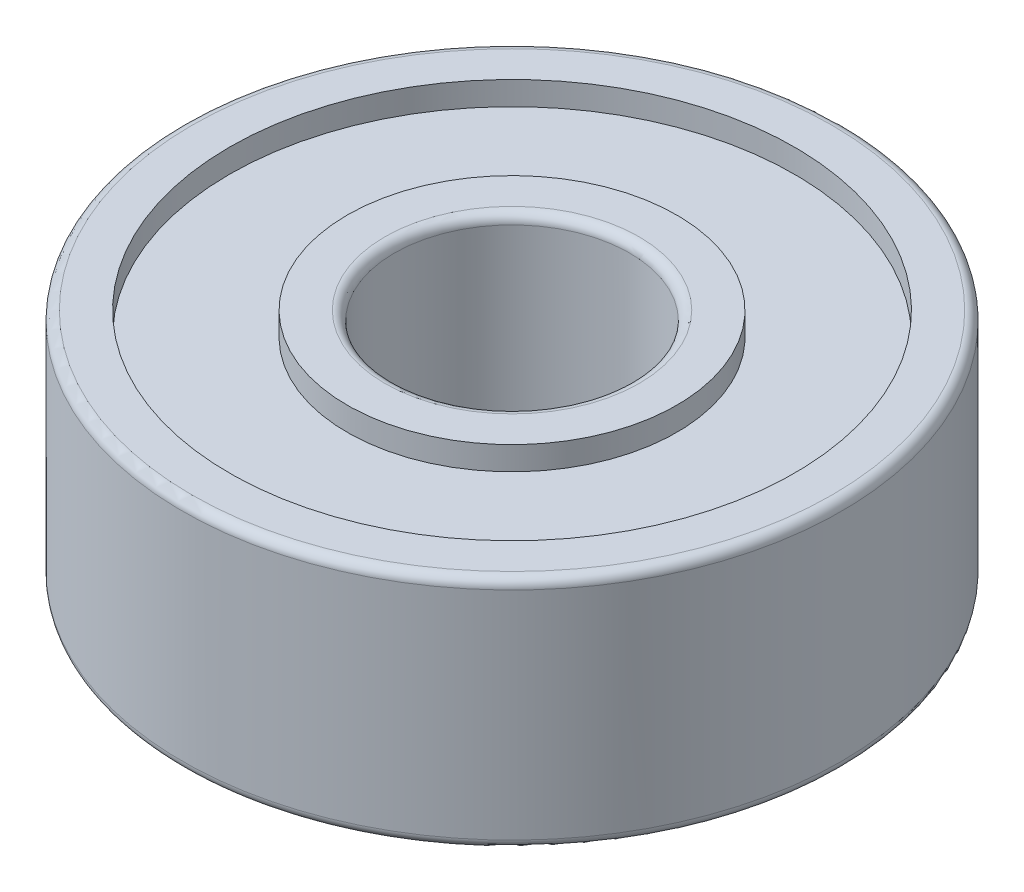
ISO-10303-21;
HEADER;
FILE_DESCRIPTION(('STEP AP214'),'2;1');
FILE_NAME('part.step','',(''),(''),'','','');
FILE_SCHEMA(('AUTOMOTIVE_DESIGN { 1 0 10303 214 1 1 1 1 }'));
ENDSEC;
DATA;
#1=APPLICATION_CONTEXT('core data for automotive mechanical design processes');
#2=APPLICATION_PROTOCOL_DEFINITION('international standard','automotive_design',2000,#1);
#3=PRODUCT_CONTEXT('',#1,'mechanical');
#4=PRODUCT('Part','Part','',(#3));
#5=PRODUCT_RELATED_PRODUCT_CATEGORY('part','',(#4));
#6=PRODUCT_DEFINITION_FORMATION('','',#4);
#7=PRODUCT_DEFINITION_CONTEXT('part definition',#1,'design');
#8=PRODUCT_DEFINITION('design','',#6,#7);
#9=PRODUCT_DEFINITION_SHAPE('','',#8);
#10=(LENGTH_UNIT() NAMED_UNIT(*) SI_UNIT(.MILLI.,.METRE.));
#11=(NAMED_UNIT(*) PLANE_ANGLE_UNIT() SI_UNIT($,.RADIAN.));
#12=(NAMED_UNIT(*) SI_UNIT($,.STERADIAN.) SOLID_ANGLE_UNIT());
#13=UNCERTAINTY_MEASURE_WITH_UNIT(LENGTH_MEASURE(1.E-05),#10,'distance_accuracy_value','');
#14=(GEOMETRIC_REPRESENTATION_CONTEXT(3) GLOBAL_UNCERTAINTY_ASSIGNED_CONTEXT((#13)) GLOBAL_UNIT_ASSIGNED_CONTEXT((#10,
#11,#12)) REPRESENTATION_CONTEXT('',''));
#15=CARTESIAN_POINT('',(0.,0.,0.));
#16=DIRECTION('',(0.,0.,1.));
#17=DIRECTION('',(1.,0.,0.));
#18=AXIS2_PLACEMENT_3D('',#15,#16,#17);
#19=CARTESIAN_POINT('',(0.,5.,0.));
#20=DIRECTION('',(0.,1.,0.));
#21=DIRECTION('',(-1.,0.,0.));
#22=AXIS2_PLACEMENT_3D('',#19,#20,#21);
#23=CYLINDRICAL_SURFACE('',#22,2.5);
#24=CARTESIAN_POINT('',(0.,0.200000000000003,0.));
#25=DIRECTION('',(0.,-1.,0.));
#26=DIRECTION('',(1.,0.,0.));
#27=AXIS2_PLACEMENT_3D('',#24,#25,#26);
#28=CIRCLE('',#27,2.5);
#29=CARTESIAN_POINT('',(2.5,0.200000000000005,0.));
#30=VERTEX_POINT('',#29);
#31=EDGE_CURVE('E55',#30,#30,#28,.T.);
#32=ORIENTED_EDGE('',*,*,#31,.T.);
#33=EDGE_LOOP('',(#32));
#34=FACE_BOUND('',#33,.T.);
#35=CARTESIAN_POINT('',(0.,4.8,0.));
#36=DIRECTION('',(0.,1.,0.));
#37=DIRECTION('',(-1.,0.,0.));
#38=AXIS2_PLACEMENT_3D('',#35,#36,#37);
#39=CIRCLE('',#38,2.5);
#40=CARTESIAN_POINT('',(-2.5,4.8,0.));
#41=VERTEX_POINT('',#40);
#42=EDGE_CURVE('E58',#41,#41,#39,.T.);
#43=ORIENTED_EDGE('',*,*,#42,.T.);
#44=EDGE_LOOP('',(#43));
#45=FACE_BOUND('',#44,.T.);
#46=ADVANCED_FACE('F32',(#34,#45),#23,.F.);
#47=CARTESIAN_POINT('',(-2.5,0.,0.));
#48=DIRECTION('',(0.,-1.,0.));
#49=DIRECTION('',(1.,0.,0.));
#50=AXIS2_PLACEMENT_3D('',#47,#48,#49);
#51=PLANE('',#50);
#52=CARTESIAN_POINT('',(0.,0.,0.));
#53=DIRECTION('',(0.,-1.,0.));
#54=DIRECTION('',(1.,0.,0.));
#55=AXIS2_PLACEMENT_3D('',#52,#53,#54);
#56=CIRCLE('',#55,2.7);
#57=CARTESIAN_POINT('',(2.7,0.,0.));
#58=VERTEX_POINT('',#57);
#59=EDGE_CURVE('E61',#58,#58,#56,.F.);
#60=ORIENTED_EDGE('',*,*,#59,.T.);
#61=EDGE_LOOP('',(#60));
#62=FACE_BOUND('',#61,.T.);
#63=CARTESIAN_POINT('',(0.,0.,0.));
#64=DIRECTION('',(0.,1.,0.));
#65=DIRECTION('',(-1.,0.,0.));
#66=AXIS2_PLACEMENT_3D('',#63,#64,#65);
#67=CIRCLE('',#66,3.5);
#68=CARTESIAN_POINT('',(-3.5,0.,0.));
#69=VERTEX_POINT('',#68);
#70=EDGE_CURVE('E64',#69,#69,#67,.T.);
#71=ORIENTED_EDGE('',*,*,#70,.F.);
#72=EDGE_LOOP('',(#71));
#73=FACE_BOUND('',#72,.T.);
#74=ADVANCED_FACE('F107',(#62,#73),#51,.T.);
#75=CARTESIAN_POINT('',(0.,5.,0.));
#76=DIRECTION('',(0.,1.,0.));
#77=DIRECTION('',(-1.,0.,0.));
#78=AXIS2_PLACEMENT_3D('',#75,#76,#77);
#79=CYLINDRICAL_SURFACE('',#78,3.5);
#80=ORIENTED_EDGE('',*,*,#70,.T.);
#81=EDGE_LOOP('',(#80));
#82=FACE_BOUND('',#81,.T.);
#83=CARTESIAN_POINT('',(0.,0.500000000000004,0.));
#84=DIRECTION('',(0.,1.,0.));
#85=DIRECTION('',(-1.,0.,0.));
#86=AXIS2_PLACEMENT_3D('',#83,#84,#85);
#87=CIRCLE('',#86,3.5);
#88=CARTESIAN_POINT('',(-3.5,0.500000000000001,0.));
#89=VERTEX_POINT('',#88);
#90=EDGE_CURVE('E67',#89,#89,#87,.T.);
#91=ORIENTED_EDGE('',*,*,#90,.F.);
#92=EDGE_LOOP('',(#91));
#93=FACE_BOUND('',#92,.T.);
#94=ADVANCED_FACE('F113',(#82,#93),#79,.T.);
#95=CARTESIAN_POINT('',(-3.5,0.500000000000001,0.));
#96=DIRECTION('',(0.,-1.,0.));
#97=DIRECTION('',(1.,0.,0.));
#98=AXIS2_PLACEMENT_3D('',#95,#96,#97);
#99=PLANE('',#98);
#100=ORIENTED_EDGE('',*,*,#90,.T.);
#101=EDGE_LOOP('',(#100));
#102=FACE_BOUND('',#101,.T.);
#103=CARTESIAN_POINT('',(0.,0.500000000000006,0.));
#104=DIRECTION('',(0.,1.,0.));
#105=DIRECTION('',(-1.,0.,0.));
#106=AXIS2_PLACEMENT_3D('',#103,#104,#105);
#107=CIRCLE('',#106,6.);
#108=CARTESIAN_POINT('',(-6.,0.5,0.));
#109=VERTEX_POINT('',#108);
#110=EDGE_CURVE('E70',#109,#109,#107,.T.);
#111=ORIENTED_EDGE('',*,*,#110,.F.);
#112=EDGE_LOOP('',(#111));
#113=FACE_BOUND('',#112,.T.);
#114=ADVANCED_FACE('F154',(#102,#113),#99,.T.);
#115=CARTESIAN_POINT('',(0.,5.,0.));
#116=DIRECTION('',(0.,1.,0.));
#117=DIRECTION('',(-1.,0.,0.));
#118=AXIS2_PLACEMENT_3D('',#115,#116,#117);
#119=CYLINDRICAL_SURFACE('',#118,6.);
#120=ORIENTED_EDGE('',*,*,#110,.T.);
#121=EDGE_LOOP('',(#120));
#122=FACE_BOUND('',#121,.T.);
#123=CARTESIAN_POINT('',(0.,0.,0.));
#124=DIRECTION('',(0.,1.,0.));
#125=DIRECTION('',(-1.,0.,0.));
#126=AXIS2_PLACEMENT_3D('',#123,#124,#125);
#127=CIRCLE('',#126,6.);
#128=CARTESIAN_POINT('',(-6.,0.,0.));
#129=VERTEX_POINT('',#128);
#130=EDGE_CURVE('E73',#129,#129,#127,.T.);
#131=ORIENTED_EDGE('',*,*,#130,.F.);
#132=EDGE_LOOP('',(#131));
#133=FACE_BOUND('',#132,.T.);
#134=ADVANCED_FACE('F148',(#122,#133),#119,.F.);
#135=CARTESIAN_POINT('',(-6.,0.,0.));
#136=DIRECTION('',(0.,-1.,0.));
#137=DIRECTION('',(1.,0.,0.));
#138=AXIS2_PLACEMENT_3D('',#135,#136,#137);
#139=PLANE('',#138);
#140=CARTESIAN_POINT('',(0.,0.,0.));
#141=DIRECTION('',(0.,-1.,0.));
#142=DIRECTION('',(1.,0.,0.));
#143=AXIS2_PLACEMENT_3D('',#140,#141,#142);
#144=CIRCLE('',#143,6.8);
#145=CARTESIAN_POINT('',(6.8,0.,0.));
#146=VERTEX_POINT('',#145);
#147=EDGE_CURVE('E39',#146,#146,#144,.T.);
#148=ORIENTED_EDGE('',*,*,#147,.T.);
#149=EDGE_LOOP('',(#148));
#150=FACE_BOUND('',#149,.T.);
#151=ORIENTED_EDGE('',*,*,#130,.T.);
#152=EDGE_LOOP('',(#151));
#153=FACE_BOUND('',#152,.T.);
#154=ADVANCED_FACE('F139',(#150,#153),#139,.T.);
#155=CARTESIAN_POINT('',(0.,5.,0.));
#156=DIRECTION('',(0.,1.,0.));
#157=DIRECTION('',(-1.,0.,0.));
#158=AXIS2_PLACEMENT_3D('',#155,#156,#157);
#159=CYLINDRICAL_SURFACE('',#158,7.);
#160=CARTESIAN_POINT('',(0.,0.200000000000005,0.));
#161=DIRECTION('',(0.,-1.,0.));
#162=DIRECTION('',(1.,0.,0.));
#163=AXIS2_PLACEMENT_3D('',#160,#161,#162);
#164=CIRCLE('',#163,7.);
#165=CARTESIAN_POINT('',(7.,0.200000000000011,0.));
#166=VERTEX_POINT('',#165);
#167=EDGE_CURVE('E43',#166,#166,#164,.F.);
#168=ORIENTED_EDGE('',*,*,#167,.T.);
#169=EDGE_LOOP('',(#168));
#170=FACE_BOUND('',#169,.T.);
#171=CARTESIAN_POINT('',(0.,4.80000000000001,0.));
#172=DIRECTION('',(0.,1.,0.));
#173=DIRECTION('',(-1.,0.,0.));
#174=AXIS2_PLACEMENT_3D('',#171,#172,#173);
#175=CIRCLE('',#174,7.);
#176=CARTESIAN_POINT('',(-7.,4.8,0.));
#177=VERTEX_POINT('',#176);
#178=EDGE_CURVE('E47',#177,#177,#175,.F.);
#179=ORIENTED_EDGE('',*,*,#178,.T.);
#180=EDGE_LOOP('',(#179));
#181=FACE_BOUND('',#180,.T.);
#182=ADVANCED_FACE('F135',(#170,#181),#159,.T.);
#183=CARTESIAN_POINT('',(-7.,5.,0.));
#184=DIRECTION('',(0.,1.,0.));
#185=DIRECTION('',(-1.,0.,0.));
#186=AXIS2_PLACEMENT_3D('',#183,#184,#185);
#187=PLANE('',#186);
#188=CARTESIAN_POINT('',(0.,5.,0.));
#189=DIRECTION('',(0.,1.,0.));
#190=DIRECTION('',(-1.,0.,0.));
#191=AXIS2_PLACEMENT_3D('',#188,#189,#190);
#192=CIRCLE('',#191,6.8);
#193=CARTESIAN_POINT('',(-6.8,5.,0.));
#194=VERTEX_POINT('',#193);
#195=EDGE_CURVE('E10',#194,#194,#192,.T.);
#196=ORIENTED_EDGE('',*,*,#195,.T.);
#197=EDGE_LOOP('',(#196));
#198=FACE_BOUND('',#197,.T.);
#199=CARTESIAN_POINT('',(0.,5.,0.));
#200=DIRECTION('',(0.,1.,0.));
#201=DIRECTION('',(-1.,0.,0.));
#202=AXIS2_PLACEMENT_3D('',#199,#200,#201);
#203=CIRCLE('',#202,5.99999999999999);
#204=CARTESIAN_POINT('',(-6.,5.,0.));
#205=VERTEX_POINT('',#204);
#206=EDGE_CURVE('E76',#205,#205,#203,.T.);
#207=ORIENTED_EDGE('',*,*,#206,.F.);
#208=EDGE_LOOP('',(#207));
#209=FACE_BOUND('',#208,.T.);
#210=ADVANCED_FACE('F138',(#198,#209),#187,.T.);
#211=CARTESIAN_POINT('',(0.,5.,0.));
#212=DIRECTION('',(0.,1.,0.));
#213=DIRECTION('',(-1.,0.,0.));
#214=AXIS2_PLACEMENT_3D('',#211,#212,#213);
#215=CYLINDRICAL_SURFACE('',#214,5.99999999999999);
#216=ORIENTED_EDGE('',*,*,#206,.T.);
#217=EDGE_LOOP('',(#216));
#218=FACE_BOUND('',#217,.T.);
#219=CARTESIAN_POINT('',(0.,4.5,0.));
#220=DIRECTION('',(0.,1.,0.));
#221=DIRECTION('',(-1.,0.,0.));
#222=AXIS2_PLACEMENT_3D('',#219,#220,#221);
#223=CIRCLE('',#222,6.);
#224=CARTESIAN_POINT('',(-6.,4.5,0.));
#225=VERTEX_POINT('',#224);
#226=EDGE_CURVE('E79',#225,#225,#223,.T.);
#227=ORIENTED_EDGE('',*,*,#226,.F.);
#228=EDGE_LOOP('',(#227));
#229=FACE_BOUND('',#228,.T.);
#230=ADVANCED_FACE('F103',(#218,#229),#215,.F.);
#231=CARTESIAN_POINT('',(-6.,4.5,0.));
#232=DIRECTION('',(0.,1.,0.));
#233=DIRECTION('',(-1.,0.,0.));
#234=AXIS2_PLACEMENT_3D('',#231,#232,#233);
#235=PLANE('',#234);
#236=ORIENTED_EDGE('',*,*,#226,.T.);
#237=EDGE_LOOP('',(#236));
#238=FACE_BOUND('',#237,.T.);
#239=CARTESIAN_POINT('',(0.,4.5,0.));
#240=DIRECTION('',(0.,1.,0.));
#241=DIRECTION('',(-1.,0.,0.));
#242=AXIS2_PLACEMENT_3D('',#239,#240,#241);
#243=CIRCLE('',#242,3.5);
#244=CARTESIAN_POINT('',(-3.5,4.5,0.));
#245=VERTEX_POINT('',#244);
#246=EDGE_CURVE('E82',#245,#245,#243,.T.);
#247=ORIENTED_EDGE('',*,*,#246,.F.);
#248=EDGE_LOOP('',(#247));
#249=FACE_BOUND('',#248,.T.);
#250=ADVANCED_FACE('F93',(#238,#249),#235,.T.);
#251=CARTESIAN_POINT('',(0.,5.,0.));
#252=DIRECTION('',(0.,1.,0.));
#253=DIRECTION('',(-1.,0.,0.));
#254=AXIS2_PLACEMENT_3D('',#251,#252,#253);
#255=CYLINDRICAL_SURFACE('',#254,3.5);
#256=ORIENTED_EDGE('',*,*,#246,.T.);
#257=EDGE_LOOP('',(#256));
#258=FACE_BOUND('',#257,.T.);
#259=CARTESIAN_POINT('',(0.,5.,0.));
#260=DIRECTION('',(0.,1.,0.));
#261=DIRECTION('',(-1.,0.,0.));
#262=AXIS2_PLACEMENT_3D('',#259,#260,#261);
#263=CIRCLE('',#262,3.5);
#264=CARTESIAN_POINT('',(-3.5,5.,0.));
#265=VERTEX_POINT('',#264);
#266=EDGE_CURVE('E85',#265,#265,#263,.T.);
#267=ORIENTED_EDGE('',*,*,#266,.F.);
#268=EDGE_LOOP('',(#267));
#269=FACE_BOUND('',#268,.T.);
#270=ADVANCED_FACE('F91',(#258,#269),#255,.T.);
#271=CARTESIAN_POINT('',(-3.5,5.,0.));
#272=DIRECTION('',(0.,1.,0.));
#273=DIRECTION('',(-1.,0.,0.));
#274=AXIS2_PLACEMENT_3D('',#271,#272,#273);
#275=PLANE('',#274);
#276=CARTESIAN_POINT('',(0.,5.,0.));
#277=DIRECTION('',(0.,1.,0.));
#278=DIRECTION('',(-1.,0.,0.));
#279=AXIS2_PLACEMENT_3D('',#276,#277,#278);
#280=CIRCLE('',#279,2.7);
#281=CARTESIAN_POINT('',(-2.7,5.,0.));
#282=VERTEX_POINT('',#281);
#283=EDGE_CURVE('E52',#282,#282,#280,.F.);
#284=ORIENTED_EDGE('',*,*,#283,.T.);
#285=EDGE_LOOP('',(#284));
#286=FACE_BOUND('',#285,.T.);
#287=ORIENTED_EDGE('',*,*,#266,.T.);
#288=EDGE_LOOP('',(#287));
#289=FACE_BOUND('',#288,.T.);
#290=ADVANCED_FACE('F89',(#286,#289),#275,.T.);
#291=CARTESIAN_POINT('',(0.,0.200000000000003,0.));
#292=DIRECTION('',(0.,-1.,0.));
#293=DIRECTION('',(1.,0.,0.));
#294=AXIS2_PLACEMENT_3D('',#291,#292,#293);
#295=TOROIDAL_SURFACE('',#294,2.7,0.2);
#296=ORIENTED_EDGE('',*,*,#31,.F.);
#297=EDGE_LOOP('',(#296));
#298=FACE_BOUND('',#297,.T.);
#299=ORIENTED_EDGE('',*,*,#59,.F.);
#300=EDGE_LOOP('',(#299));
#301=FACE_BOUND('',#300,.T.);
#302=ADVANCED_FACE('F100',(#298,#301),#295,.T.);
#303=CARTESIAN_POINT('',(0.,4.8,0.));
#304=DIRECTION('',(0.,1.,0.));
#305=DIRECTION('',(-1.,0.,0.));
#306=AXIS2_PLACEMENT_3D('',#303,#304,#305);
#307=TOROIDAL_SURFACE('',#306,2.7,0.2);
#308=ORIENTED_EDGE('',*,*,#283,.F.);
#309=EDGE_LOOP('',(#308));
#310=FACE_BOUND('',#309,.T.);
#311=ORIENTED_EDGE('',*,*,#42,.F.);
#312=EDGE_LOOP('',(#311));
#313=FACE_BOUND('',#312,.T.);
#314=ADVANCED_FACE('F121',(#310,#313),#307,.T.);
#315=CARTESIAN_POINT('',(0.,0.200000000000005,0.));
#316=DIRECTION('',(0.,-1.,0.));
#317=DIRECTION('',(1.,0.,0.));
#318=AXIS2_PLACEMENT_3D('',#315,#316,#317);
#319=TOROIDAL_SURFACE('',#318,6.8,0.2);
#320=ORIENTED_EDGE('',*,*,#147,.F.);
#321=EDGE_LOOP('',(#320));
#322=FACE_BOUND('',#321,.T.);
#323=ORIENTED_EDGE('',*,*,#167,.F.);
#324=EDGE_LOOP('',(#323));
#325=FACE_BOUND('',#324,.T.);
#326=ADVANCED_FACE('F124',(#322,#325),#319,.T.);
#327=CARTESIAN_POINT('',(0.,4.80000000000001,0.));
#328=DIRECTION('',(0.,1.,0.));
#329=DIRECTION('',(-1.,0.,0.));
#330=AXIS2_PLACEMENT_3D('',#327,#328,#329);
#331=TOROIDAL_SURFACE('',#330,6.8,0.2);
#332=ORIENTED_EDGE('',*,*,#178,.F.);
#333=EDGE_LOOP('',(#332));
#334=FACE_BOUND('',#333,.T.);
#335=ORIENTED_EDGE('',*,*,#195,.F.);
#336=EDGE_LOOP('',(#335));
#337=FACE_BOUND('',#336,.T.);
#338=ADVANCED_FACE('F34',(#334,#337),#331,.T.);
#339=CLOSED_SHELL('',(#46,#74,#94,#114,#134,#154,#182,#210,#230,#250,#270,#290,#302,#314,#326,#338));
#340=MANIFOLD_SOLID_BREP('B2',#339);
#341=ADVANCED_BREP_SHAPE_REPRESENTATION('',(#18,#340),#14);
#342=SHAPE_DEFINITION_REPRESENTATION(#9,#341);
ENDSEC;
END-ISO-10303-21;
